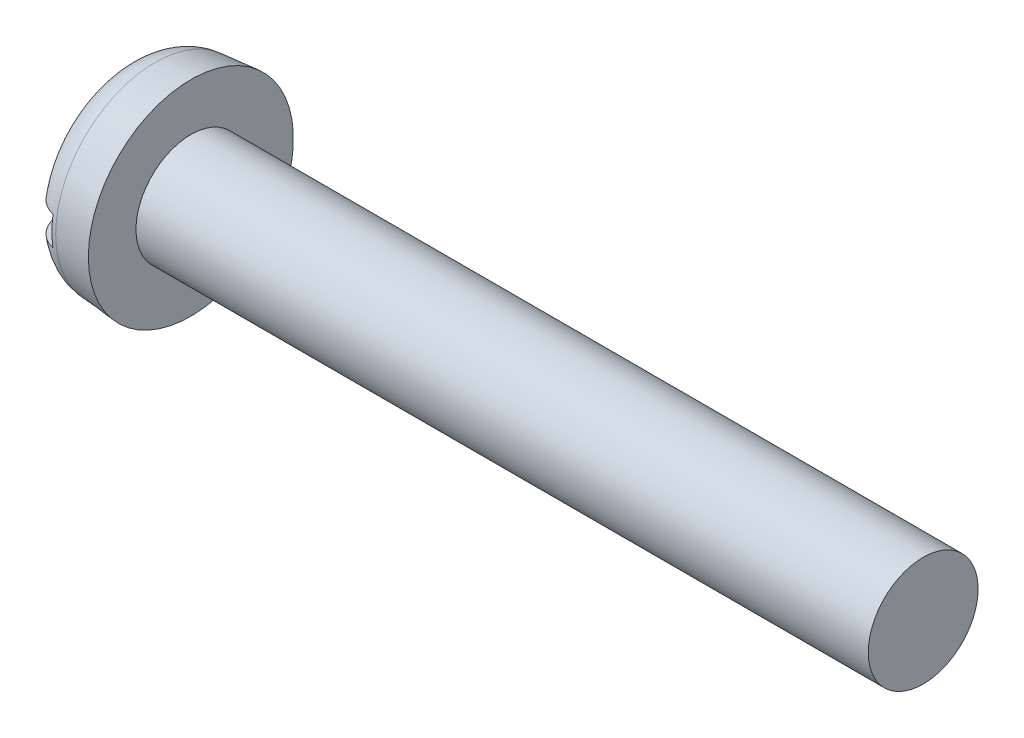
ISO-10303-21;
HEADER;
FILE_DESCRIPTION(('STEP AP214'),'2;1');
FILE_NAME('part.step','',(''),(''),'','','');
FILE_SCHEMA(('AUTOMOTIVE_DESIGN { 1 0 10303 214 1 1 1 1 }'));
ENDSEC;
DATA;
#1=APPLICATION_CONTEXT('core data for automotive mechanical design processes');
#2=APPLICATION_PROTOCOL_DEFINITION('international standard','automotive_design',2000,#1);
#3=PRODUCT_CONTEXT('',#1,'mechanical');
#4=PRODUCT('Part','Part','',(#3));
#5=PRODUCT_RELATED_PRODUCT_CATEGORY('part','',(#4));
#6=PRODUCT_DEFINITION_FORMATION('','',#4);
#7=PRODUCT_DEFINITION_CONTEXT('part definition',#1,'design');
#8=PRODUCT_DEFINITION('design','',#6,#7);
#9=PRODUCT_DEFINITION_SHAPE('','',#8);
#10=(LENGTH_UNIT() NAMED_UNIT(*) SI_UNIT(.MILLI.,.METRE.));
#11=(NAMED_UNIT(*) PLANE_ANGLE_UNIT() SI_UNIT($,.RADIAN.));
#12=(NAMED_UNIT(*) SI_UNIT($,.STERADIAN.) SOLID_ANGLE_UNIT());
#13=UNCERTAINTY_MEASURE_WITH_UNIT(LENGTH_MEASURE(1.E-05),#10,'distance_accuracy_value','');
#14=(GEOMETRIC_REPRESENTATION_CONTEXT(3) GLOBAL_UNCERTAINTY_ASSIGNED_CONTEXT((#13)) GLOBAL_UNIT_ASSIGNED_CONTEXT((#10,
#11,#12)) REPRESENTATION_CONTEXT('',''));
#15=CARTESIAN_POINT('',(0.,0.,0.));
#16=DIRECTION('',(0.,0.,1.));
#17=DIRECTION('',(1.,0.,0.));
#18=AXIS2_PLACEMENT_3D('',#15,#16,#17);
#19=CARTESIAN_POINT('',(0.,0.,0.));
#20=DIRECTION('',(-1.,0.,0.));
#21=DIRECTION('',(0.,0.,1.));
#22=AXIS2_PLACEMENT_3D('',#19,#20,#21);
#23=PLANE('',#22);
#24=DIRECTION('',(0.,0.,-1.));
#25=VECTOR('',#24,1.);
#26=CARTESIAN_POINT('',(0.,0.4,2.8));
#27=LINE('',#26,#25);
#28=CARTESIAN_POINT('',(0.,0.4,1.77326763142532));
#29=VERTEX_POINT('',#28);
#30=CARTESIAN_POINT('',(0.,0.4,-1.77326763142532));
#31=VERTEX_POINT('',#30);
#32=EDGE_CURVE('E88',#29,#31,#27,.T.);
#33=ORIENTED_EDGE('',*,*,#32,.F.);
#34=CARTESIAN_POINT('',(0.,0.,0.));
#35=DIRECTION('',(-1.,0.,0.));
#36=DIRECTION('',(0.,0.,1.));
#37=AXIS2_PLACEMENT_3D('',#34,#35,#36);
#38=CIRCLE('',#37,1.81782234903766);
#39=EDGE_CURVE('E94',#29,#31,#38,.T.);
#40=ORIENTED_EDGE('',*,*,#39,.T.);
#41=EDGE_LOOP('',(#33,#40));
#42=FACE_BOUND('',#41,.T.);
#43=ADVANCED_FACE('F35',(#42),#23,.T.);
#44=CARTESIAN_POINT('',(-25.4,0.,0.));
#45=DIRECTION('',(-1.,0.,0.));
#46=DIRECTION('',(0.,0.,1.));
#47=AXIS2_PLACEMENT_3D('',#44,#45,#46);
#48=CYLINDRICAL_SURFACE('',#47,1.5);
#49=CARTESIAN_POINT('',(21.8,0.,0.));
#50=DIRECTION('',(-1.,0.,0.));
#51=DIRECTION('',(0.,0.,1.));
#52=AXIS2_PLACEMENT_3D('',#49,#50,#51);
#53=CIRCLE('',#52,1.5);
#54=CARTESIAN_POINT('',(21.8,0.,1.5));
#55=VERTEX_POINT('',#54);
#56=EDGE_CURVE('E95',#55,#55,#53,.T.);
#57=ORIENTED_EDGE('',*,*,#56,.T.);
#58=EDGE_LOOP('',(#57));
#59=FACE_BOUND('',#58,.T.);
#60=CARTESIAN_POINT('',(1.8,0.,0.));
#61=DIRECTION('',(-1.,0.,0.));
#62=DIRECTION('',(0.,0.,1.));
#63=AXIS2_PLACEMENT_3D('',#60,#61,#62);
#64=CIRCLE('',#63,1.5);
#65=CARTESIAN_POINT('',(1.8,0.,1.5));
#66=VERTEX_POINT('',#65);
#67=EDGE_CURVE('E152',#66,#66,#64,.T.);
#68=ORIENTED_EDGE('',*,*,#67,.F.);
#69=EDGE_LOOP('',(#68));
#70=FACE_BOUND('',#69,.T.);
#71=ADVANCED_FACE('F140',(#59,#70),#48,.T.);
#72=CARTESIAN_POINT('',(21.8,1.5,0.));
#73=DIRECTION('',(1.,0.,0.));
#74=DIRECTION('',(0.,0.,-1.));
#75=AXIS2_PLACEMENT_3D('',#72,#73,#74);
#76=PLANE('',#75);
#77=ORIENTED_EDGE('',*,*,#56,.F.);
#78=EDGE_LOOP('',(#77));
#79=FACE_BOUND('',#78,.T.);
#80=ADVANCED_FACE('F138',(#79),#76,.T.);
#81=DIRECTION('',(0.,0.,1.));
#82=VECTOR('',#81,1.);
#83=CARTESIAN_POINT('',(0.,-0.4,-2.8));
#84=LINE('',#83,#82);
#85=CARTESIAN_POINT('',(0.,-0.4,-1.77326763142532));
#86=VERTEX_POINT('',#85);
#87=CARTESIAN_POINT('',(0.,-0.4,1.77326763142532));
#88=VERTEX_POINT('',#87);
#89=EDGE_CURVE('E79',#86,#88,#84,.T.);
#90=ORIENTED_EDGE('',*,*,#89,.F.);
#91=EDGE_CURVE('E86',#86,#88,#38,.T.);
#92=ORIENTED_EDGE('',*,*,#91,.T.);
#93=EDGE_LOOP('',(#90,#92));
#94=FACE_BOUND('',#93,.T.);
#95=ADVANCED_FACE('F85',(#94),#23,.T.);
#96=CARTESIAN_POINT('',(0.,0.,0.));
#97=DIRECTION('',(1.,0.,0.));
#98=DIRECTION('',(0.,0.,-1.));
#99=AXIS2_PLACEMENT_3D('',#96,#97,#98);
#100=CONICAL_SURFACE('',#99,2.64252040565334,0.0872664625997168);
#101=CARTESIAN_POINT('',(0.821559831527111,0.,0.));
#102=DIRECTION('',(-1.,0.,0.));
#103=DIRECTION('',(0.,0.,1.));
#104=AXIS2_PLACEMENT_3D('',#101,#102,#103);
#105=CIRCLE('',#104,2.71439757732023);
#106=CARTESIAN_POINT('',(0.821559831527111,0.,2.71439757732023));
#107=VERTEX_POINT('',#106);
#108=EDGE_CURVE('E98',#107,#107,#105,.F.);
#109=ORIENTED_EDGE('',*,*,#108,.T.);
#110=EDGE_LOOP('',(#109));
#111=FACE_BOUND('',#110,.T.);
#112=CARTESIAN_POINT('',(1.8,0.,0.));
#113=DIRECTION('',(-1.,0.,0.));
#114=DIRECTION('',(0.,0.,1.));
#115=AXIS2_PLACEMENT_3D('',#112,#113,#114);
#116=CIRCLE('',#115,2.8);
#117=CARTESIAN_POINT('',(1.8,0.,2.8));
#118=VERTEX_POINT('',#117);
#119=EDGE_CURVE('E100',#118,#118,#116,.T.);
#120=ORIENTED_EDGE('',*,*,#119,.T.);
#121=EDGE_LOOP('',(#120));
#122=FACE_BOUND('',#121,.T.);
#123=ADVANCED_FACE('F131',(#111,#122),#100,.T.);
#124=CARTESIAN_POINT('',(1.8,1.5,0.));
#125=DIRECTION('',(-1.,0.,0.));
#126=DIRECTION('',(0.,0.,1.));
#127=AXIS2_PLACEMENT_3D('',#124,#125,#126);
#128=PLANE('',#127);
#129=ORIENTED_EDGE('',*,*,#119,.F.);
#130=EDGE_LOOP('',(#129));
#131=FACE_BOUND('',#130,.T.);
#132=ORIENTED_EDGE('',*,*,#67,.T.);
#133=EDGE_LOOP('',(#132));
#134=FACE_BOUND('',#133,.T.);
#135=ADVANCED_FACE('F127',(#131,#134),#128,.F.);
#136=CARTESIAN_POINT('',(0.9,0.,0.));
#137=DIRECTION('',(-1.,0.,0.));
#138=DIRECTION('',(0.,0.,1.));
#139=AXIS2_PLACEMENT_3D('',#136,#137,#138);
#140=TOROIDAL_SURFACE('',#139,1.81782234903766,0.9);
#141=CARTESIAN_POINT('',(0.285780762477817,0.4,-2.44311963508101));
#142=CARTESIAN_POINT('',(0.322325244969282,0.4,-2.47769297217772));
#143=CARTESIAN_POINT('',(0.361794878156767,0.4,-2.50922544126929));
#144=CARTESIAN_POINT('',(0.445493757535043,0.4,-2.56525291577746));
#145=CARTESIAN_POINT('',(0.48972822484029,0.4,-2.58974009118149));
#146=CARTESIAN_POINT('',(0.581685294636184,0.4,-2.63091846199156));
#147=CARTESIAN_POINT('',(0.629407305379898,0.4,-2.64761097641683));
#148=CARTESIAN_POINT('',(0.726972312257169,0.4,-2.67270033258514));
#149=CARTESIAN_POINT('',(0.776814803129367,0.4,-2.68109913910669));
#150=CARTESIAN_POINT('',(0.876977038697279,0.4,-2.68933922206438));
#151=CARTESIAN_POINT('',(0.92729364560996,0.4,-2.68921866149007));
#152=CARTESIAN_POINT('',(1.02719093347253,0.4,-2.68051830929739));
#153=CARTESIAN_POINT('',(1.07677160162593,0.4,-2.67193837076201));
#154=CARTESIAN_POINT('',(1.17371760664879,0.4,-2.6465919807109));
#155=CARTESIAN_POINT('',(1.2210859954371,0.4,-2.62983719558013));
#156=CARTESIAN_POINT('',(1.31235127069059,0.4,-2.58864040768255));
#157=CARTESIAN_POINT('',(1.35624813968071,0.4,-2.56419836622246));
#158=CARTESIAN_POINT('',(1.43950339303332,0.4,-2.50824069345436));
#159=CARTESIAN_POINT('',(1.47884484993389,0.4,-2.47669988555644));
#160=CARTESIAN_POINT('',(1.55173067508121,0.4,-2.40751412200212));
#161=CARTESIAN_POINT('',(1.5852748745774,0.4,-2.36986898871862));
#162=CARTESIAN_POINT('',(1.64594872274809,0.4,-2.28919528368316));
#163=CARTESIAN_POINT('',(1.67301846569636,0.4,-2.24612167422176));
#164=CARTESIAN_POINT('',(1.71966197411636,0.4,-2.15609376898817));
#165=CARTESIAN_POINT('',(1.73923530584546,0.4,-2.10913924885738));
#166=CARTESIAN_POINT('',(1.77066025907209,0.4,-2.01194193646076));
#167=CARTESIAN_POINT('',(1.78239254664628,0.4,-1.96166058810882));
#168=CARTESIAN_POINT('',(1.7974373595853,0.4,-1.85985639013623));
#169=CARTESIAN_POINT('',(1.80074908437145,0.4,-1.80833342293966));
#170=CARTESIAN_POINT('',(1.79894832980293,0.4,-1.70434405475568));
#171=CARTESIAN_POINT('',(1.79365584590562,0.4,-1.651880798299));
#172=CARTESIAN_POINT('',(1.77456092354076,0.4,-1.54852841034414));
#173=CARTESIAN_POINT('',(1.76075741543224,0.4,-1.49763947754675));
#174=CARTESIAN_POINT('',(1.7246504916629,0.4,-1.3975266769579));
#175=CARTESIAN_POINT('',(1.70214283236717,0.4,-1.34837644263265));
#176=CARTESIAN_POINT('',(1.64933120824444,0.4,-1.25444995564252));
#177=CARTESIAN_POINT('',(1.6190255468442,0.4,-1.20967465773975));
#178=CARTESIAN_POINT('',(1.55085214424215,0.4,-1.12504927254803));
#179=CARTESIAN_POINT('',(1.51286662510254,0.4,-1.08529386793689));
#180=CARTESIAN_POINT('',(1.4306134165613,0.4,-1.01288372669284));
#181=CARTESIAN_POINT('',(1.38634513970435,0.4,-0.98022965477811));
#182=CARTESIAN_POINT('',(1.29378824575784,0.4,-0.924048107397016));
#183=CARTESIAN_POINT('',(1.24562231583718,0.4,-0.900319541839471));
#184=CARTESIAN_POINT('',(1.14574424072186,0.4,-0.862177327128565));
#185=CARTESIAN_POINT('',(1.09403573066562,0.4,-0.847754283110134));
#186=CARTESIAN_POINT('',(0.993395643106033,0.4,-0.830011922353258));
#187=CARTESIAN_POINT('',(0.944615271160061,0.4,-0.825833796085956));
#188=CARTESIAN_POINT('',(0.847107354416665,0.4,-0.826334878356685));
#189=CARTESIAN_POINT('',(0.798379798268946,0.4,-0.831011470142969));
#190=CARTESIAN_POINT('',(0.705495670608722,0.4,-0.848340731069384));
#191=CARTESIAN_POINT('',(0.661242330843084,0.4,-0.860484898174224));
#192=CARTESIAN_POINT('',(0.575232402842407,0.4,-0.891650416332973));
#193=CARTESIAN_POINT('',(0.53347652813922,0.4,-0.910673721938904));
#194=CARTESIAN_POINT('',(0.451191926076944,0.4,-0.956010770911779));
#195=CARTESIAN_POINT('',(0.41084895856706,0.4,-0.982660648611481));
#196=CARTESIAN_POINT('',(0.334722321142851,0.4,-1.04182188589593));
#197=CARTESIAN_POINT('',(0.298940164912517,0.4,-1.0743351828853));
#198=CARTESIAN_POINT('',(0.229649980616187,0.4,-1.14749226888793));
#199=CARTESIAN_POINT('',(0.196634914830279,0.4,-1.18860403936715));
#200=CARTESIAN_POINT('',(0.137645150810002,0.4,-1.27560624817727));
#201=CARTESIAN_POINT('',(0.111672172806045,0.4,-1.32149785033543));
#202=CARTESIAN_POINT('',(0.0665593590158842,0.4,-1.41881690272049));
#203=CARTESIAN_POINT('',(0.0477401615322292,0.4,-1.47039354331754));
#204=CARTESIAN_POINT('',(0.0191028447664946,0.4,-1.57598967955257));
#205=CARTESIAN_POINT('',(0.00928429911433809,0.4,-1.63000905934828));
#206=CARTESIAN_POINT('',(-0.000908845669418395,0.4,-1.73850050809585));
#207=CARTESIAN_POINT('',(-0.00135843890630447,0.4,-1.7929654882335));
#208=CARTESIAN_POINT('',(0.0071379486879365,0.4,-1.90117587148683));
#209=CARTESIAN_POINT('',(0.0160852351491476,0.4,-1.9549211735574));
#210=CARTESIAN_POINT('',(0.0428869469078852,0.4,-2.05874477252473));
#211=CARTESIAN_POINT('',(0.0605196216319731,0.4,-2.10888044427302));
#212=CARTESIAN_POINT('',(0.104140493725079,0.4,-2.20532358851202));
#213=CARTESIAN_POINT('',(0.130117020588857,0.4,-2.25163629510255));
#214=CARTESIAN_POINT('',(0.178150945787742,0.4,-2.32211375046635));
#215=CARTESIAN_POINT('',(0.197843641859489,0.4,-2.34792122195273));
#216=CARTESIAN_POINT('',(0.239879292580621,0.4,-2.39728022756983));
#217=CARTESIAN_POINT('',(0.26222221206527,0.4,-2.42083179162577));
#218=CARTESIAN_POINT('',(0.285780762477817,0.4,-2.44311963508101));
#219=B_SPLINE_CURVE_WITH_KNOTS('',3,(#141,#142,#143,#144,#145,#146,#147,#148,#149,#150,#151,
#152,#153,#154,#155,#156,#157,#158,#159,#160,#161,#162,#163,#164,#165,#166,#167,#168,#169,#170,
#171,#172,#173,#174,#175,#176,#177,#178,#179,#180,#181,#182,#183,#184,#185,#186,#187,#188,#189,
#190,#191,#192,#193,#194,#195,#196,#197,#198,#199,#200,#201,#202,#203,#204,#205,#206,#207,#208,
#209,#210,#211,#212,#213,#214,#215,#216,#217,#218),.UNSPECIFIED.,.T.,.F.,(4,2,2,2,2,2,2,2,2,2,2,
2,2,2,2,2,2,2,2,2,2,2,2,2,2,2,2,2,2,2,2,2,2,2,2,2,2,2,4),(0.,0.150804282209429,
0.301775523831159,0.452721208703323,0.603631125974155,0.753865076726384,0.904101636690626,
1.05412441728995,1.2041479530309,1.35471219197995,1.50528081291864,1.65719291262943,
1.80911380065295,1.96329712022902,2.11749509812026,2.27496068670365,2.43244606914274,
2.59387611122166,2.75534130458713,2.9195015653164,3.08367718561128,3.24389389244898,
3.40394859014677,3.55004213794101,3.69609251881817,3.83315592967566,3.97025831464732,
4.11470991133513,4.25920932580005,4.41668805635775,4.57420522099046,4.73812462607052,
4.90203626571949,5.06463536051201,5.22725705028985,5.38592661841767,5.54437521558828,
5.64159310397338,5.73880970255809),.UNSPECIFIED.);
#220=CARTESIAN_POINT('',(0.7,0.4,-2.66547244738019));
#221=VERTEX_POINT('',#220);
#222=EDGE_CURVE('E11',#31,#221,#219,.T.);
#223=ORIENTED_EDGE('',*,*,#222,.F.);
#224=ORIENTED_EDGE('',*,*,#39,.F.);
#225=CARTESIAN_POINT('',(0.356169071138295,0.4,1.02545886384317));
#226=CARTESIAN_POINT('',(0.394477383289829,0.4,0.994276095963573));
#227=CARTESIAN_POINT('',(0.435252098816795,0.4,0.966090537778846));
#228=CARTESIAN_POINT('',(0.520874070068605,0.4,0.916713010685472));
#229=CARTESIAN_POINT('',(0.565722974989389,0.4,0.895523890103121));
#230=CARTESIAN_POINT('',(0.658585145836014,0.4,0.861072215462474));
#231=CARTESIAN_POINT('',(0.706609437889925,0.4,0.84783908573147));
#232=CARTESIAN_POINT('',(0.804243253507339,0.4,0.83024223356215));
#233=CARTESIAN_POINT('',(0.853851628876229,0.4,0.825872228699233));
#234=CARTESIAN_POINT('',(0.950010182321422,0.4,0.826277197704913));
#235=CARTESIAN_POINT('',(0.996563474122619,0.4,0.830513937244102));
#236=CARTESIAN_POINT('',(1.08828168676608,0.4,0.846797595491544));
#237=CARTESIAN_POINT('',(1.1334463088223,0.4,0.858846182848628));
#238=CARTESIAN_POINT('',(1.22099947575276,0.4,0.890027753500388));
#239=CARTESIAN_POINT('',(1.26339999097867,0.4,0.909127417221131));
#240=CARTESIAN_POINT('',(1.34475562295769,0.4,0.953613660794996));
#241=CARTESIAN_POINT('',(1.38370973618203,0.4,0.979002063689565));
#242=CARTESIAN_POINT('',(1.4606297229717,0.4,1.03768873851847));
#243=CARTESIAN_POINT('',(1.49821861120609,0.4,1.07148126912977));
#244=CARTESIAN_POINT('',(1.56766557552966,0.4,1.14451739265722));
#245=CARTESIAN_POINT('',(1.59952174981566,0.4,1.18376278691406));
#246=CARTESIAN_POINT('',(1.65882951195037,0.4,1.26965174466254));
#247=CARTESIAN_POINT('',(1.68580874421987,0.4,1.3166225459502));
#248=CARTESIAN_POINT('',(1.7316261790846,0.4,1.41438438512647));
#249=CARTESIAN_POINT('',(1.7504634598458,0.4,1.46517585482832));
#250=CARTESIAN_POINT('',(1.77959171793735,0.4,1.56990546726));
#251=CARTESIAN_POINT('',(1.78976336496765,0.4,1.62387693551388));
#252=CARTESIAN_POINT('',(1.80070617985939,0.4,1.73276786407042));
#253=CARTESIAN_POINT('',(1.80147810121521,0.4,1.78768724803349));
#254=CARTESIAN_POINT('',(1.7935515731225,0.4,1.89576039323533));
#255=CARTESIAN_POINT('',(1.78503812714098,0.4,1.94892767588158));
#256=CARTESIAN_POINT('',(1.75897009134329,0.4,2.05299963181348));
#257=CARTESIAN_POINT('',(1.74141670948687,0.4,2.10390460641263));
#258=CARTESIAN_POINT('',(1.69825810143573,0.4,2.20064023444731));
#259=CARTESIAN_POINT('',(1.67286703477487,0.4,2.24656646381803));
#260=CARTESIAN_POINT('',(1.61458416704904,0.4,2.33338474929434));
#261=CARTESIAN_POINT('',(1.58169323312494,0.4,2.37427738654701));
#262=CARTESIAN_POINT('',(1.51007060998367,0.4,2.44900649357427));
#263=CARTESIAN_POINT('',(1.47146964140907,0.4,2.48296829636122));
#264=CARTESIAN_POINT('',(1.38904817001727,0.4,2.54382334084698));
#265=CARTESIAN_POINT('',(1.34522808158393,0.4,2.57071714318276));
#266=CARTESIAN_POINT('',(1.25424836231413,0.4,2.61630908807752));
#267=CARTESIAN_POINT('',(1.20714119293126,0.4,2.63511196373395));
#268=CARTESIAN_POINT('',(1.11042474691739,0.4,2.66447616047847));
#269=CARTESIAN_POINT('',(1.06081558875378,0.4,2.67503787139057));
#270=CARTESIAN_POINT('',(0.960893961973374,0.4,2.68755622717405));
#271=CARTESIAN_POINT('',(0.910589316471373,0.4,2.68957539390776));
#272=CARTESIAN_POINT('',(0.810358152757914,0.4,2.68512046084422));
#273=CARTESIAN_POINT('',(0.760431626986744,0.4,2.67864653130185));
#274=CARTESIAN_POINT('',(0.662478823238217,0.4,2.65741995217084));
#275=CARTESIAN_POINT('',(0.614448868329621,0.4,2.64268425826029));
#276=CARTESIAN_POINT('',(0.521534433162197,0.4,2.60538142887937));
#277=CARTESIAN_POINT('',(0.476649962619439,0.4,2.58281426921971));
#278=CARTESIAN_POINT('',(0.391148993047609,0.4,2.53043182461717));
#279=CARTESIAN_POINT('',(0.350545548527357,0.4,2.50059523892845));
#280=CARTESIAN_POINT('',(0.274874117650141,0.4,2.43457977439371));
#281=CARTESIAN_POINT('',(0.239806285839746,0.4,2.39840071853429));
#282=CARTESIAN_POINT('',(0.175879279186199,0.4,2.32042102737606));
#283=CARTESIAN_POINT('',(0.147073507775005,0.4,2.27857662814835));
#284=CARTESIAN_POINT('',(0.0967847753411474,0.4,2.19069995841567));
#285=CARTESIAN_POINT('',(0.07530224160311,0.4,2.14466744374764));
#286=CARTESIAN_POINT('',(0.0399276675747797,0.4,2.04903409979779));
#287=CARTESIAN_POINT('',(0.0261471165350434,0.4,1.99939205575588));
#288=CARTESIAN_POINT('',(0.00693602242391574,0.4,1.89852251200784));
#289=CARTESIAN_POINT('',(0.00150590448368233,0.4,1.84729493171548));
#290=CARTESIAN_POINT('',(-0.000985777473937043,0.4,1.74359522844075));
#291=CARTESIAN_POINT('',(0.00212519999965263,0.4,1.69111899279254));
#292=CARTESIAN_POINT('',(0.0168916821616578,0.4,1.58737297380086));
#293=CARTESIAN_POINT('',(0.0285499964789277,0.4,1.53610359288829));
#294=CARTESIAN_POINT('',(0.0604020950384818,0.4,1.43486374575567));
#295=CARTESIAN_POINT('',(0.0808043159051547,0.4,1.38495893538538));
#296=CARTESIAN_POINT('',(0.129530825890043,0.4,1.28921347783136));
#297=CARTESIAN_POINT('',(0.157849403934622,0.4,1.24336993202389));
#298=CARTESIAN_POINT('',(0.213684916145749,0.4,1.16773658539622));
#299=CARTESIAN_POINT('',(0.239651023875377,0.4,1.13678903007943));
#300=CARTESIAN_POINT('',(0.29525297901351,0.4,1.07838116842152));
#301=CARTESIAN_POINT('',(0.324888803246328,0.4,1.05092084005941));
#302=CARTESIAN_POINT('',(0.356169071138295,0.4,1.02545886384317));
#303=B_SPLINE_CURVE_WITH_KNOTS('',3,(#225,#226,#227,#228,#229,#230,#231,#232,#233,#234,#235,
#236,#237,#238,#239,#240,#241,#242,#243,#244,#245,#246,#247,#248,#249,#250,#251,#252,#253,#254,
#255,#256,#257,#258,#259,#260,#261,#262,#263,#264,#265,#266,#267,#268,#269,#270,#271,#272,#273,
#274,#275,#276,#277,#278,#279,#280,#281,#282,#283,#284,#285,#286,#287,#288,#289,#290,#291,#292,
#293,#294,#295,#296,#297,#298,#299,#300,#301,#302),.UNSPECIFIED.,.T.,.F.,(4,2,2,2,2,2,2,2,2,2,2,
2,2,2,2,2,2,2,2,2,2,2,2,2,2,2,2,2,2,2,2,2,2,2,2,2,2,2,4),(0.,0.148056677712979,
0.296173556814866,0.444834912477076,0.593390856036848,0.732942639414739,0.87252424155987,
1.01145452751666,1.15042513517956,1.30141738715291,1.45245963818336,1.61420969223844,
1.7759780548859,1.93993961693164,2.10388803551639,2.26462860972824,2.42534771058163,
2.5820147845557,2.73866375372932,2.89216335268838,3.04565077231286,3.19708679229202,
3.34851564860216,3.49883427697698,3.64914989207022,3.79915813668078,3.94916684463061,
4.09962050651671,4.25007836811616,4.40177296660437,4.55347641441351,4.70732244078731,
4.86117629939849,5.0181609530014,5.17519723279955,5.33620557401864,5.49709805791682,
5.61799301592463,5.73888721047272),.UNSPECIFIED.);
#304=CARTESIAN_POINT('',(0.7,0.4,2.66547244738019));
#305=VERTEX_POINT('',#304);
#306=EDGE_CURVE('E112',#305,#29,#303,.T.);
#307=ORIENTED_EDGE('',*,*,#306,.F.);
#308=CARTESIAN_POINT('',(0.7,0.,0.));
#309=DIRECTION('',(-1.,0.,0.));
#310=DIRECTION('',(0.,0.,1.));
#311=AXIS2_PLACEMENT_3D('',#308,#309,#310);
#312=CIRCLE('',#311,2.69531878777687);
#313=CARTESIAN_POINT('',(0.7,-0.4,2.66547244738019));
#314=VERTEX_POINT('',#313);
#315=EDGE_CURVE('E106',#305,#314,#312,.F.);
#316=ORIENTED_EDGE('',*,*,#315,.T.);
#317=CARTESIAN_POINT('',(0.356169071138295,-0.4,1.02545886384317));
#318=CARTESIAN_POINT('',(0.314031332279046,-0.4,1.05976167261355));
#319=CARTESIAN_POINT('',(0.274819372687131,-0.4,1.0977427449374));
#320=CARTESIAN_POINT('',(0.20326819432942,-0.4,1.17978565669674));
#321=CARTESIAN_POINT('',(0.170942545508555,-0.4,1.22385922524595));
#322=CARTESIAN_POINT('',(0.114111407238762,-0.4,1.31672727393884));
#323=CARTESIAN_POINT('',(0.0895968760226377,-0.4,1.36551620987613));
#324=CARTESIAN_POINT('',(0.0490785202121341,-0.4,1.46648183341045));
#325=CARTESIAN_POINT('',(0.0330703604686472,-0.4,1.51865678013273));
#326=CARTESIAN_POINT('',(0.0100453697545741,-0.4,1.62518908376032));
#327=CARTESIAN_POINT('',(0.00306618218707067,-0.4,1.67955460937645));
#328=CARTESIAN_POINT('',(-0.00144685561490171,-0.4,1.78868546318226));
#329=CARTESIAN_POINT('',(0.00101939609011308,-0.4,1.84345079568049));
#330=CARTESIAN_POINT('',(0.0152891480749748,-0.4,1.95052330416009));
#331=CARTESIAN_POINT('',(0.0268854930795697,-0.4,2.0028580557661));
#332=CARTESIAN_POINT('',(0.0589248901673074,-0.4,2.10474672243029));
#333=CARTESIAN_POINT('',(0.0793666318053631,-0.4,2.15430104818042));
#334=CARTESIAN_POINT('',(0.12795627217374,-0.4,2.24792186385266));
#335=CARTESIAN_POINT('',(0.155901237504733,-0.4,2.29209371256844));
#336=CARTESIAN_POINT('',(0.218944857951455,-0.4,2.37499861286517));
#337=CARTESIAN_POINT('',(0.254042725445853,-0.4,2.41373226246544));
#338=CARTESIAN_POINT('',(0.32966685096813,-0.4,2.48389534278566));
#339=CARTESIAN_POINT('',(0.370077637452011,-0.4,2.51544927894014));
#340=CARTESIAN_POINT('',(0.455677448683675,-0.4,2.57122459505542));
#341=CARTESIAN_POINT('',(0.50086612816506,-0.4,2.59544650436481));
#342=CARTESIAN_POINT('',(0.59413782417454,-0.4,2.6355729416184));
#343=CARTESIAN_POINT('',(0.642178527071037,-0.4,2.65157587103637));
#344=CARTESIAN_POINT('',(0.740273420359946,-0.4,2.67523109383666));
#345=CARTESIAN_POINT('',(0.790327524333045,-0.4,2.68288374523438));
#346=CARTESIAN_POINT('',(0.890686133385993,-0.4,2.68958762962226));
#347=CARTESIAN_POINT('',(0.940986998851126,-0.4,2.68869347246838));
#348=CARTESIAN_POINT('',(1.04072178380744,-0.4,2.67846167879018));
#349=CARTESIAN_POINT('',(1.0901557170213,-0.4,2.66912417603886));
#350=CARTESIAN_POINT('',(1.18669599164727,-0.4,2.64229877559468));
#351=CARTESIAN_POINT('',(1.23380501833184,-0.4,2.6248205362643));
#352=CARTESIAN_POINT('',(1.32443528846507,-0.4,2.58223220159563));
#353=CARTESIAN_POINT('',(1.36795650500275,-0.4,2.5571220490195));
#354=CARTESIAN_POINT('',(1.45036421793263,-0.4,2.49989362614525));
#355=CARTESIAN_POINT('',(1.48923230512215,-0.4,2.46774885590998));
#356=CARTESIAN_POINT('',(1.56107927302393,-0.4,2.39744378923729));
#357=CARTESIAN_POINT('',(1.59405796507024,-0.4,2.35928330016087));
#358=CARTESIAN_POINT('',(1.65352847250663,-0.4,2.2776666814067));
#359=CARTESIAN_POINT('',(1.67995797143492,-0.4,2.23416516156708));
#360=CARTESIAN_POINT('',(1.72526137908633,-0.4,2.14339421504175));
#361=CARTESIAN_POINT('',(1.74413484906926,-0.4,2.09612456975119));
#362=CARTESIAN_POINT('',(1.77411508290512,-0.4,1.9983989612356));
#363=CARTESIAN_POINT('',(1.78509960932637,-0.4,1.9479055243096));
#364=CARTESIAN_POINT('',(1.79862667184961,-0.4,1.84580292273346));
#365=CARTESIAN_POINT('',(1.80116838107033,-0.4,1.79419364929756));
#366=CARTESIAN_POINT('',(1.79780993826834,-0.4,1.69014314952536));
#367=CARTESIAN_POINT('',(1.79172746900389,-0.4,1.63770783465182));
#368=CARTESIAN_POINT('',(1.77106806778027,-0.4,1.53454005861514));
#369=CARTESIAN_POINT('',(1.75649007103968,-0.4,1.48380781174802));
#370=CARTESIAN_POINT('',(1.7188487103298,-0.4,1.38413781596447));
#371=CARTESIAN_POINT('',(1.69558194660123,-0.4,1.33527684770509));
#372=CARTESIAN_POINT('',(1.64130257902653,-0.4,1.24205401456033));
#373=CARTESIAN_POINT('',(1.6102882125599,-0.4,1.19769317671197));
#374=CARTESIAN_POINT('',(1.54078360718032,-0.4,1.11407031283595));
#375=CARTESIAN_POINT('',(1.50218355419827,-0.4,1.07489936013486));
#376=CARTESIAN_POINT('',(1.41879382359701,-0.4,1.00377929202409));
#377=CARTESIAN_POINT('',(1.37400377230517,-0.4,0.971830612909673));
#378=CARTESIAN_POINT('',(1.28066227969846,-0.4,0.917245549760186));
#379=CARTESIAN_POINT('',(1.23224470963451,-0.4,0.894381439836964));
#380=CARTESIAN_POINT('',(1.13202516716603,-0.4,0.858023892867302));
#381=CARTESIAN_POINT('',(1.08022692076976,-0.4,0.844520323748755));
#382=CARTESIAN_POINT('',(0.979686768939646,-0.4,0.828554710074538));
#383=CARTESIAN_POINT('',(0.931083582720591,-0.4,0.82521631591368));
#384=CARTESIAN_POINT('',(0.834057576527118,-0.4,0.827306267768065));
#385=CARTESIAN_POINT('',(0.785634764475608,-0.4,0.832734994430688));
#386=CARTESIAN_POINT('',(0.693219129123408,-0.4,0.851440182721389));
#387=CARTESIAN_POINT('',(0.6491307615266,-0.4,0.864254528165209));
#388=CARTESIAN_POINT('',(0.563580966367806,-0.4,0.896690334746237));
#389=CARTESIAN_POINT('',(0.522117110679347,-0.4,0.916305391888431));
#390=CARTESIAN_POINT('',(0.460201335026829,-0.4,0.951554535089635));
#391=CARTESIAN_POINT('',(0.438547037771904,-0.4,0.965129512636782));
#392=CARTESIAN_POINT('',(0.396436028831446,-0.4,0.994018383793284));
#393=CARTESIAN_POINT('',(0.375979221006585,-0.4,1.00933213751562));
#394=CARTESIAN_POINT('',(0.356169071138295,-0.4,1.02545886384317));
#395=B_SPLINE_CURVE_WITH_KNOTS('',3,(#317,#318,#319,#320,#321,#322,#323,#324,#325,#326,#327,
#328,#329,#330,#331,#332,#333,#334,#335,#336,#337,#338,#339,#340,#341,#342,#343,#344,#345,#346,
#347,#348,#349,#350,#351,#352,#353,#354,#355,#356,#357,#358,#359,#360,#361,#362,#363,#364,#365,
#366,#367,#368,#369,#370,#371,#372,#373,#374,#375,#376,#377,#378,#379,#380,#381,#382,#383,#384,
#385,#386,#387,#388,#389,#390,#391,#392,#393,#394),.UNSPECIFIED.,.T.,.F.,(4,2,2,2,2,2,2,2,2,2,2,
2,2,2,2,2,2,2,2,2,2,2,2,2,2,2,2,2,2,2,2,2,2,2,2,2,2,2,4),(0.,0.162908543977832,
0.326135200101453,0.489172220791498,0.652126072139755,0.815757140806174,0.979389975458609,
1.13941349616251,1.29941331750199,1.45545894016543,1.61148738958683,1.76455910424509,
1.91761976498379,2.068802492645,2.21997873814259,2.37018969158947,2.52039826519579,
2.67042907998157,2.82046101999671,2.97106818075077,3.12168016531919,3.27367450756494,
3.42567767407005,3.5799880622519,3.73431356299688,3.89195060675763,4.04960741210517,
4.2112132976058,4.37285598283535,4.5370386362033,4.70123120514444,4.86099956435944,
5.02059471531597,5.16597452097208,5.31136063884072,5.44850857150574,5.58552770590542,
5.66212180496716,5.73870974628516),.UNSPECIFIED.);
#396=EDGE_CURVE('E93',#88,#314,#395,.T.);
#397=ORIENTED_EDGE('',*,*,#396,.F.);
#398=ORIENTED_EDGE('',*,*,#91,.F.);
#399=CARTESIAN_POINT('',(0.285780762477817,-0.4,-2.44311963508101));
#400=CARTESIAN_POINT('',(0.248557143829482,-0.4,-2.4078972812164));
#401=CARTESIAN_POINT('',(0.21431245236119,-0.4,-2.3694650707352));
#402=CARTESIAN_POINT('',(0.152768043532584,-0.4,-2.28733938194963));
#403=CARTESIAN_POINT('',(0.125478130377416,-0.4,-2.24363860286105));
#404=CARTESIAN_POINT('',(0.0786257158649476,-0.4,-2.15234079857027));
#405=CARTESIAN_POINT('',(0.0590537929026404,-0.4,-2.10474861000723));
#406=CARTESIAN_POINT('',(0.0280650821156157,-0.4,-2.00700047851119));
#407=CARTESIAN_POINT('',(0.0166461813020745,-0.4,-1.95684520345737));
#408=CARTESIAN_POINT('',(0.00206923204411924,-0.4,-1.85464080389292));
#409=CARTESIAN_POINT('',(-0.000972085111053216,-0.4,-1.80257506295451));
#410=CARTESIAN_POINT('',(0.00151453147792929,-0.4,-1.69864852440772));
#411=CARTESIAN_POINT('',(0.00704382880236595,-0.4,-1.64678776072725));
#412=CARTESIAN_POINT('',(0.0266516864050342,-0.4,-1.5434240201059));
#413=CARTESIAN_POINT('',(0.0409314131746844,-0.4,-1.49195921679783));
#414=CARTESIAN_POINT('',(0.0777275151672627,-0.4,-1.39206285915813));
#415=CARTESIAN_POINT('',(0.100245079836245,-0.4,-1.34363174403842));
#416=CARTESIAN_POINT('',(0.153482972183088,-0.4,-1.2500005252344));
#417=CARTESIAN_POINT('',(0.184382352554496,-0.4,-1.20490211419648));
#418=CARTESIAN_POINT('',(0.253306595403157,-0.4,-1.12049761259773));
#419=CARTESIAN_POINT('',(0.291333458753369,-0.4,-1.08119315410127));
#420=CARTESIAN_POINT('',(0.373599819825438,-0.4,-1.00962170698056));
#421=CARTESIAN_POINT('',(0.417845144124488,-0.4,-0.977361391817105));
#422=CARTESIAN_POINT('',(0.511393224424661,-0.4,-0.921257408160295));
#423=CARTESIAN_POINT('',(0.560693424544353,-0.4,-0.897409512943095));
#424=CARTESIAN_POINT('',(0.659899494014213,-0.4,-0.86056620148907));
#425=CARTESIAN_POINT('',(0.70959665550847,-0.4,-0.847011806093055));
#426=CARTESIAN_POINT('',(0.81063175641273,-0.4,-0.829407026781007));
#427=CARTESIAN_POINT('',(0.861968199741098,-0.4,-0.825348214635538));
#428=CARTESIAN_POINT('',(0.959752077480286,-0.4,-0.82693832731787));
#429=CARTESIAN_POINT('',(1.00621575887746,-0.4,-0.831730406017744));
#430=CARTESIAN_POINT('',(1.09766854953413,-0.4,-0.849077179323799));
#431=CARTESIAN_POINT('',(1.14265739171951,-0.4,-0.861633271803835));
#432=CARTESIAN_POINT('',(1.2299114176728,-0.4,-0.893807868219966));
#433=CARTESIAN_POINT('',(1.27218175788193,-0.4,-0.913412506998421));
#434=CARTESIAN_POINT('',(1.35320643219735,-0.4,-0.958874855551496));
#435=CARTESIAN_POINT('',(1.39195973961517,-0.4,-0.984734383223624));
#436=CARTESIAN_POINT('',(1.46843970297676,-0.4,-1.04440221898529));
#437=CARTESIAN_POINT('',(1.5057776319984,-0.4,-1.07870901508261));
#438=CARTESIAN_POINT('',(1.57463408911242,-0.4,-1.15273784634507));
#439=CARTESIAN_POINT('',(1.60615068897795,-0.4,-1.19246166827117));
#440=CARTESIAN_POINT('',(1.66460952025841,-0.4,-1.27921419766999));
#441=CARTESIAN_POINT('',(1.69108592858502,-0.4,-1.32655784594953));
#442=CARTESIAN_POINT('',(1.73582713929311,-0.4,-1.42498260596115));
#443=CARTESIAN_POINT('',(1.75409110005355,-0.4,-1.47606410012852));
#444=CARTESIAN_POINT('',(1.7819800651308,-0.4,-1.58118959955467));
#445=CARTESIAN_POINT('',(1.79150042969761,-0.4,-1.63526148025197));
#446=CARTESIAN_POINT('',(1.80112725488866,-0.4,-1.74424014808114));
#447=CARTESIAN_POINT('',(1.80123449731023,-0.4,-1.79914686549765));
#448=CARTESIAN_POINT('',(1.79200090917881,-0.4,-1.90704889801334));
#449=CARTESIAN_POINT('',(1.78285023172313,-0.4,-1.96006044029451));
#450=CARTESIAN_POINT('',(1.75554489311913,-0.4,-2.06371351442585));
#451=CARTESIAN_POINT('',(1.73739144905737,-0.4,-2.11435536562275));
#452=CARTESIAN_POINT('',(1.69310212999213,-0.4,-2.21047686976185));
#453=CARTESIAN_POINT('',(1.66717834059447,-0.4,-2.25605427430112));
#454=CARTESIAN_POINT('',(1.60789945686383,-0.4,-2.34209023989538));
#455=CARTESIAN_POINT('',(1.57454519739076,-0.4,-2.38254937521993));
#456=CARTESIAN_POINT('',(1.50207992140168,-0.4,-2.45635864078367));
#457=CARTESIAN_POINT('',(1.46309647311969,-0.4,-2.48983406282631));
#458=CARTESIAN_POINT('',(1.37999946341266,-0.4,-2.54966020191344));
#459=CARTESIAN_POINT('',(1.33588629200968,-0.4,-2.57601146011503));
#460=CARTESIAN_POINT('',(1.24441048294309,-0.4,-2.6204920842224));
#461=CARTESIAN_POINT('',(1.19709806498187,-0.4,-2.63872477396665));
#462=CARTESIAN_POINT('',(1.10007286159794,-0.4,-2.66692299241135));
#463=CARTESIAN_POINT('',(1.05036028930681,-0.4,-2.67688925373976));
#464=CARTESIAN_POINT('',(0.950330778412724,-0.4,-2.68821568147498));
#465=CARTESIAN_POINT('',(0.900020830724849,-0.4,-2.68963769422185));
#466=CARTESIAN_POINT('',(0.799864722777445,-0.4,-2.68399705480249));
#467=CARTESIAN_POINT('',(0.750018680334321,-0.4,-2.67693230351107));
#468=CARTESIAN_POINT('',(0.652295079642407,-0.4,-2.6545442288954));
#469=CARTESIAN_POINT('',(0.604414938079601,-0.4,-2.63923214293824));
#470=CARTESIAN_POINT('',(0.511939743577346,-0.4,-2.60081753553039));
#471=CARTESIAN_POINT('',(0.467340561615687,-0.4,-2.5777250172516));
#472=CARTESIAN_POINT('',(0.400101785238431,-0.4,-2.53543999984867));
#473=CARTESIAN_POINT('',(0.375979970292489,-0.4,-2.51855507086787));
#474=CARTESIAN_POINT('',(0.329505055171142,-0.4,-2.48250598020391));
#475=CARTESIAN_POINT('',(0.307151944649364,-0.4,-2.46334183185513));
#476=CARTESIAN_POINT('',(0.285780762477817,-0.4,-2.44311963508101));
#477=B_SPLINE_CURVE_WITH_KNOTS('',3,(#399,#400,#401,#402,#403,#404,#405,#406,#407,#408,#409,
#410,#411,#412,#413,#414,#415,#416,#417,#418,#419,#420,#421,#422,#423,#424,#425,#426,#427,#428,
#429,#430,#431,#432,#433,#434,#435,#436,#437,#438,#439,#440,#441,#442,#443,#444,#445,#446,#447,
#448,#449,#450,#451,#452,#453,#454,#455,#456,#457,#458,#459,#460,#461,#462,#463,#464,#465,#466,
#467,#468,#469,#470,#471,#472,#473,#474,#475,#476),.UNSPECIFIED.,.T.,.F.,(4,2,2,2,2,2,2,2,2,2,2,
2,2,2,2,2,2,2,2,2,2,2,2,2,2,2,2,2,2,2,2,2,2,2,2,2,2,2,4),(0.,0.153630076563003,0.30747554336492,
0.461132620212027,0.614749859849374,0.770496992161263,0.926268906303976,1.08576372212915,
1.24528157620828,1.40851960556979,1.57180352898442,1.73524147908282,1.89859719430262,
2.05228040591997,2.205827157294,2.34528036488284,2.48475868767391,2.62396413120245,
2.7632100815968,2.91467905032863,3.06619810123316,3.22817436288511,3.39016722026913,
3.55407439716564,3.71796796090444,3.87856222841603,4.03913479105936,4.19567175163465,
4.35219113316334,4.50560019509845,4.65899760068397,4.81038266514853,4.96175431138951,
5.1120289424741,5.26234075029904,5.41244826767269,5.56236352612232,5.65056762019062,
5.73877119825418),.UNSPECIFIED.);
#478=CARTESIAN_POINT('',(0.7,-0.4,-2.66547244738019));
#479=VERTEX_POINT('',#478);
#480=EDGE_CURVE('E47',#479,#86,#477,.T.);
#481=ORIENTED_EDGE('',*,*,#480,.F.);
#482=EDGE_CURVE('E59',#479,#221,#312,.F.);
#483=ORIENTED_EDGE('',*,*,#482,.T.);
#484=EDGE_LOOP('',(#223,#224,#307,#316,#397,#398,#481,#483));
#485=FACE_BOUND('',#484,.T.);
#486=ORIENTED_EDGE('',*,*,#108,.F.);
#487=EDGE_LOOP('',(#486));
#488=FACE_BOUND('',#487,.T.);
#489=ADVANCED_FACE('F37',(#485,#488),#140,.T.);
#490=CARTESIAN_POINT('',(0.7,0.4,2.8));
#491=DIRECTION('',(0.,1.,0.));
#492=DIRECTION('',(0.,0.,1.));
#493=AXIS2_PLACEMENT_3D('',#490,#491,#492);
#494=PLANE('',#493);
#495=ORIENTED_EDGE('',*,*,#222,.T.);
#496=DIRECTION('',(0.,0.,-1.));
#497=VECTOR('',#496,1.);
#498=CARTESIAN_POINT('',(0.7,0.4,2.8));
#499=LINE('',#498,#497);
#500=EDGE_CURVE('E87',#305,#221,#499,.T.);
#501=ORIENTED_EDGE('',*,*,#500,.F.);
#502=ORIENTED_EDGE('',*,*,#306,.T.);
#503=ORIENTED_EDGE('',*,*,#32,.T.);
#504=EDGE_LOOP('',(#495,#501,#502,#503));
#505=FACE_BOUND('',#504,.T.);
#506=ADVANCED_FACE('F119',(#505),#494,.F.);
#507=CARTESIAN_POINT('',(0.7,-0.4,-2.8));
#508=DIRECTION('',(0.,-1.,0.));
#509=DIRECTION('',(0.,0.,-1.));
#510=AXIS2_PLACEMENT_3D('',#507,#508,#509);
#511=PLANE('',#510);
#512=ORIENTED_EDGE('',*,*,#480,.T.);
#513=ORIENTED_EDGE('',*,*,#89,.T.);
#514=ORIENTED_EDGE('',*,*,#396,.T.);
#515=DIRECTION('',(0.,0.,1.));
#516=VECTOR('',#515,1.);
#517=CARTESIAN_POINT('',(0.7,-0.4,-2.8));
#518=LINE('',#517,#516);
#519=EDGE_CURVE('E54',#479,#314,#518,.T.);
#520=ORIENTED_EDGE('',*,*,#519,.F.);
#521=EDGE_LOOP('',(#512,#513,#514,#520));
#522=FACE_BOUND('',#521,.T.);
#523=ADVANCED_FACE('F78',(#522),#511,.F.);
#524=CARTESIAN_POINT('',(0.7,0.4,-2.8));
#525=DIRECTION('',(-1.,0.,0.));
#526=DIRECTION('',(0.,0.,1.));
#527=AXIS2_PLACEMENT_3D('',#524,#525,#526);
#528=PLANE('',#527);
#529=ORIENTED_EDGE('',*,*,#519,.T.);
#530=ORIENTED_EDGE('',*,*,#315,.F.);
#531=ORIENTED_EDGE('',*,*,#500,.T.);
#532=ORIENTED_EDGE('',*,*,#482,.F.);
#533=EDGE_LOOP('',(#529,#530,#531,#532));
#534=FACE_BOUND('',#533,.T.);
#535=ADVANCED_FACE('F118',(#534),#528,.T.);
#536=CLOSED_SHELL('',(#43,#71,#80,#95,#123,#135,#489,#506,#523,#535));
#537=MANIFOLD_SOLID_BREP('B2',#536);
#538=ADVANCED_BREP_SHAPE_REPRESENTATION('',(#18,#537),#14);
#539=SHAPE_DEFINITION_REPRESENTATION(#9,#538);
ENDSEC;
END-ISO-10303-21;
